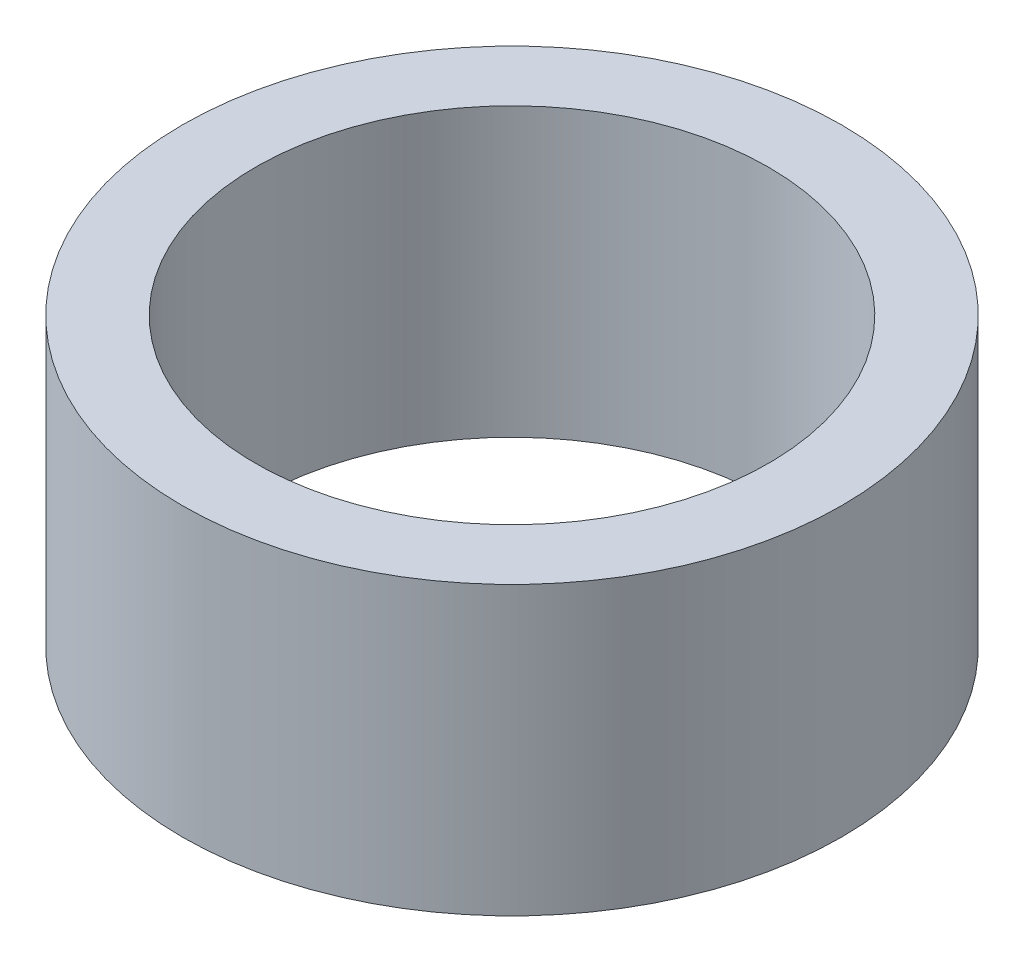
ISO-10303-21;
HEADER;
FILE_DESCRIPTION(('STEP AP214'),'2;1');
FILE_NAME('part.step','',(''),(''),'','','');
FILE_SCHEMA(('AUTOMOTIVE_DESIGN { 1 0 10303 214 1 1 1 1 }'));
ENDSEC;
DATA;
#1=APPLICATION_CONTEXT('core data for automotive mechanical design processes');
#2=APPLICATION_PROTOCOL_DEFINITION('international standard','automotive_design',2000,#1);
#3=PRODUCT_CONTEXT('',#1,'mechanical');
#4=PRODUCT('Part','Part','',(#3));
#5=PRODUCT_RELATED_PRODUCT_CATEGORY('part','',(#4));
#6=PRODUCT_DEFINITION_FORMATION('','',#4);
#7=PRODUCT_DEFINITION_CONTEXT('part definition',#1,'design');
#8=PRODUCT_DEFINITION('design','',#6,#7);
#9=PRODUCT_DEFINITION_SHAPE('','',#8);
#10=(LENGTH_UNIT() NAMED_UNIT(*) SI_UNIT(.MILLI.,.METRE.));
#11=(NAMED_UNIT(*) PLANE_ANGLE_UNIT() SI_UNIT($,.RADIAN.));
#12=(NAMED_UNIT(*) SI_UNIT($,.STERADIAN.) SOLID_ANGLE_UNIT());
#13=UNCERTAINTY_MEASURE_WITH_UNIT(LENGTH_MEASURE(1.E-05),#10,'distance_accuracy_value','');
#14=(GEOMETRIC_REPRESENTATION_CONTEXT(3) GLOBAL_UNCERTAINTY_ASSIGNED_CONTEXT((#13)) GLOBAL_UNIT_ASSIGNED_CONTEXT((#10,
#11,#12)) REPRESENTATION_CONTEXT('',''));
#15=CARTESIAN_POINT('',(0.,0.,0.));
#16=DIRECTION('',(0.,0.,1.));
#17=DIRECTION('',(1.,0.,0.));
#18=AXIS2_PLACEMENT_3D('',#15,#16,#17);
#19=CARTESIAN_POINT('',(0.,4.699499999,0.));
#20=DIRECTION('',(0.,1.,0.));
#21=DIRECTION('',(0.,0.,1.));
#22=AXIS2_PLACEMENT_3D('',#19,#20,#21);
#23=PLANE('',#22);
#24=CARTESIAN_POINT('',(0.,4.699499999,0.));
#25=DIRECTION('',(0.,1.,0.));
#26=DIRECTION('',(0.,0.,1.));
#27=AXIS2_PLACEMENT_3D('',#24,#25,#26);
#28=CIRCLE('',#27,5.3975);
#29=CARTESIAN_POINT('',(0.,4.699499999,-5.3975));
#30=VERTEX_POINT('',#29);
#31=EDGE_CURVE('E10',#30,#30,#28,.T.);
#32=ORIENTED_EDGE('',*,*,#31,.T.);
#33=EDGE_LOOP('',(#32));
#34=FACE_BOUND('',#33,.T.);
#35=CARTESIAN_POINT('',(0.,4.699499999,0.));
#36=DIRECTION('',(0.,1.,0.));
#37=DIRECTION('',(0.,0.,1.));
#38=AXIS2_PLACEMENT_3D('',#35,#36,#37);
#39=CIRCLE('',#38,4.19989);
#40=CARTESIAN_POINT('',(0.,4.699499999,-4.19989));
#41=VERTEX_POINT('',#40);
#42=EDGE_CURVE('E56',#41,#41,#39,.T.);
#43=ORIENTED_EDGE('',*,*,#42,.F.);
#44=EDGE_LOOP('',(#43));
#45=FACE_BOUND('',#44,.T.);
#46=ADVANCED_FACE('F43',(#34,#45),#23,.T.);
#47=CARTESIAN_POINT('',(0.,0.,0.));
#48=DIRECTION('',(0.,1.,0.));
#49=DIRECTION('',(0.,0.,1.));
#50=AXIS2_PLACEMENT_3D('',#47,#48,#49);
#51=PLANE('',#50);
#52=CARTESIAN_POINT('',(0.,0.,0.));
#53=DIRECTION('',(0.,1.,0.));
#54=DIRECTION('',(0.,0.,1.));
#55=AXIS2_PLACEMENT_3D('',#52,#53,#54);
#56=CIRCLE('',#55,5.3975);
#57=CARTESIAN_POINT('',(0.,0.,-5.3975));
#58=VERTEX_POINT('',#57);
#59=EDGE_CURVE('E47',#58,#58,#56,.T.);
#60=ORIENTED_EDGE('',*,*,#59,.F.);
#61=EDGE_LOOP('',(#60));
#62=FACE_BOUND('',#61,.T.);
#63=CARTESIAN_POINT('',(0.,0.,0.));
#64=DIRECTION('',(0.,1.,0.));
#65=DIRECTION('',(0.,0.,1.));
#66=AXIS2_PLACEMENT_3D('',#63,#64,#65);
#67=CIRCLE('',#66,4.19989);
#68=CARTESIAN_POINT('',(0.,0.,-4.19989));
#69=VERTEX_POINT('',#68);
#70=EDGE_CURVE('E58',#69,#69,#67,.T.);
#71=ORIENTED_EDGE('',*,*,#70,.T.);
#72=EDGE_LOOP('',(#71));
#73=FACE_BOUND('',#72,.T.);
#74=ADVANCED_FACE('F70',(#62,#73),#51,.F.);
#75=CARTESIAN_POINT('',(0.,4.699499999,0.));
#76=DIRECTION('',(0.,-1.,0.));
#77=DIRECTION('',(0.,0.,-1.));
#78=AXIS2_PLACEMENT_3D('',#75,#76,#77);
#79=CYLINDRICAL_SURFACE('',#78,5.3975);
#80=CARTESIAN_POINT('',(0.,4.699499999,-5.3975));
#81=CARTESIAN_POINT('',(0.,4.65054687401042,-5.3975));
#82=CARTESIAN_POINT('',(0.,4.60159374902083,-5.3975));
#83=CARTESIAN_POINT('',(0.,4.50368749904167,-5.3975));
#84=CARTESIAN_POINT('',(0.,4.45473437405208,-5.3975));
#85=CARTESIAN_POINT('',(0.,4.35682812407292,-5.3975));
#86=CARTESIAN_POINT('',(0.,4.30787499908333,-5.3975));
#87=CARTESIAN_POINT('',(0.,4.20996874910417,-5.3975));
#88=CARTESIAN_POINT('',(0.,4.16101562411458,-5.3975));
#89=CARTESIAN_POINT('',(0.,4.06310937413542,-5.3975));
#90=CARTESIAN_POINT('',(0.,4.01415624914583,-5.3975));
#91=CARTESIAN_POINT('',(0.,3.91624999916667,-5.3975));
#92=CARTESIAN_POINT('',(0.,3.86729687417708,-5.3975));
#93=CARTESIAN_POINT('',(0.,3.76939062419792,-5.3975));
#94=CARTESIAN_POINT('',(0.,3.72043749920833,-5.3975));
#95=CARTESIAN_POINT('',(0.,3.62253124922917,-5.3975));
#96=CARTESIAN_POINT('',(0.,3.57357812423958,-5.3975));
#97=CARTESIAN_POINT('',(0.,3.47567187426042,-5.3975));
#98=CARTESIAN_POINT('',(0.,3.42671874927083,-5.3975));
#99=CARTESIAN_POINT('',(0.,3.32881249929167,-5.3975));
#100=CARTESIAN_POINT('',(0.,3.27985937430208,-5.3975));
#101=CARTESIAN_POINT('',(0.,3.18195312432292,-5.3975));
#102=CARTESIAN_POINT('',(0.,3.13299999933333,-5.3975));
#103=CARTESIAN_POINT('',(0.,3.03509374935417,-5.3975));
#104=CARTESIAN_POINT('',(0.,2.98614062436458,-5.3975));
#105=CARTESIAN_POINT('',(0.,2.88823437438542,-5.3975));
#106=CARTESIAN_POINT('',(0.,2.83928124939583,-5.3975));
#107=CARTESIAN_POINT('',(0.,2.74137499941667,-5.3975));
#108=CARTESIAN_POINT('',(0.,2.69242187442708,-5.3975));
#109=CARTESIAN_POINT('',(0.,2.59451562444792,-5.3975));
#110=CARTESIAN_POINT('',(0.,2.54556249945833,-5.3975));
#111=CARTESIAN_POINT('',(0.,2.44765624947917,-5.3975));
#112=CARTESIAN_POINT('',(0.,2.39870312448958,-5.3975));
#113=CARTESIAN_POINT('',(0.,2.30079687451042,-5.3975));
#114=CARTESIAN_POINT('',(0.,2.25184374952083,-5.3975));
#115=CARTESIAN_POINT('',(0.,2.15393749954167,-5.3975));
#116=CARTESIAN_POINT('',(0.,2.10498437455208,-5.3975));
#117=CARTESIAN_POINT('',(0.,2.00707812457292,-5.3975));
#118=CARTESIAN_POINT('',(0.,1.95812499958333,-5.3975));
#119=CARTESIAN_POINT('',(0.,1.86021874960417,-5.3975));
#120=CARTESIAN_POINT('',(0.,1.81126562461458,-5.3975));
#121=CARTESIAN_POINT('',(0.,1.71335937463542,-5.3975));
#122=CARTESIAN_POINT('',(0.,1.66440624964583,-5.3975));
#123=CARTESIAN_POINT('',(0.,1.56649999966667,-5.3975));
#124=CARTESIAN_POINT('',(0.,1.51754687467708,-5.3975));
#125=CARTESIAN_POINT('',(0.,1.41964062469792,-5.3975));
#126=CARTESIAN_POINT('',(0.,1.37068749970833,-5.3975));
#127=CARTESIAN_POINT('',(0.,1.27278124972917,-5.3975));
#128=CARTESIAN_POINT('',(0.,1.22382812473958,-5.3975));
#129=CARTESIAN_POINT('',(0.,1.12592187476042,-5.3975));
#130=CARTESIAN_POINT('',(0.,1.07696874977083,-5.3975));
#131=CARTESIAN_POINT('',(0.,0.979062499791667,-5.3975));
#132=CARTESIAN_POINT('',(0.,0.930109374802083,-5.3975));
#133=CARTESIAN_POINT('',(0.,0.832203124822917,-5.3975));
#134=CARTESIAN_POINT('',(0.,0.783249999833333,-5.3975));
#135=CARTESIAN_POINT('',(0.,0.685343749854167,-5.3975));
#136=CARTESIAN_POINT('',(0.,0.636390624864583,-5.3975));
#137=CARTESIAN_POINT('',(0.,0.538484374885416,-5.3975));
#138=CARTESIAN_POINT('',(0.,0.489531249895833,-5.3975));
#139=CARTESIAN_POINT('',(0.,0.391624999916667,-5.3975));
#140=CARTESIAN_POINT('',(0.,0.342671874927084,-5.3975));
#141=CARTESIAN_POINT('',(0.,0.244765624947917,-5.3975));
#142=CARTESIAN_POINT('',(0.,0.195812499958333,-5.3975));
#143=CARTESIAN_POINT('',(0.,0.0979062499791664,-5.3975));
#144=CARTESIAN_POINT('',(0.,0.0489531249895832,-5.3975));
#145=CARTESIAN_POINT('',(0.,0.,-5.3975));
#146=B_SPLINE_CURVE_WITH_KNOTS('',3,(#80,#81,#82,#83,#84,#85,#86,#87,#88,#89,#90,#91,#92,#93,
#94,#95,#96,#97,#98,#99,#100,#101,#102,#103,#104,#105,#106,#107,#108,#109,#110,#111,#112,#113,
#114,#115,#116,#117,#118,#119,#120,#121,#122,#123,#124,#125,#126,#127,#128,#129,#130,#131,#132,
#133,#134,#135,#136,#137,#138,#139,#140,#141,#142,#143,#144,#145),.UNSPECIFIED.,.F.,.F.,(4,2,2,
2,2,2,2,2,2,2,2,2,2,2,2,2,2,2,2,2,2,2,2,2,2,2,2,2,2,2,2,2,4),(0.,0.14685937496875,
0.293718749937499,0.440578124906249,0.587437499875,0.734296874843749,0.881156249812499,
1.02801562478125,1.17487499975,1.32173437471875,1.4685937496875,1.61545312465625,1.762312499625,
1.90917187459375,2.0560312495625,2.20289062453125,2.3497499995,2.49660937446875,2.6434687494375,
2.79032812440625,2.937187499375,3.08404687434375,3.2309062493125,3.37776562428125,3.52462499925,
3.67148437421875,3.8183437491875,3.96520312415625,4.112062499125,4.25892187409375,
4.4057812490625,4.55264062403125,4.699499999),.UNSPECIFIED.);
#147=EDGE_CURVE('BSEAM45',#30,#58,#146,.T.);
#148=ORIENTED_EDGE('',*,*,#31,.F.);
#149=ORIENTED_EDGE('',*,*,#59,.T.);
#150=ORIENTED_EDGE('',*,*,#147,.T.);
#151=ORIENTED_EDGE('',*,*,#147,.F.);
#152=EDGE_LOOP('',(#148,#150,#149,#151));
#153=FACE_BOUND('',#152,.T.);
#154=ADVANCED_FACE('F45',(#153),#79,.T.);
#155=CARTESIAN_POINT('',(0.,4.699499999,0.));
#156=DIRECTION('',(0.,-1.,0.));
#157=DIRECTION('',(0.,0.,-1.));
#158=AXIS2_PLACEMENT_3D('',#155,#156,#157);
#159=CYLINDRICAL_SURFACE('',#158,4.19989);
#160=CARTESIAN_POINT('',(0.,4.699499999,-4.19989));
#161=CARTESIAN_POINT('',(0.,4.65054687401042,-4.19989));
#162=CARTESIAN_POINT('',(0.,4.60159374902083,-4.19989));
#163=CARTESIAN_POINT('',(0.,4.50368749904167,-4.19989));
#164=CARTESIAN_POINT('',(0.,4.45473437405208,-4.19989));
#165=CARTESIAN_POINT('',(0.,4.35682812407292,-4.19989));
#166=CARTESIAN_POINT('',(0.,4.30787499908333,-4.19989));
#167=CARTESIAN_POINT('',(0.,4.20996874910417,-4.19989));
#168=CARTESIAN_POINT('',(0.,4.16101562411458,-4.19989));
#169=CARTESIAN_POINT('',(0.,4.06310937413542,-4.19989));
#170=CARTESIAN_POINT('',(0.,4.01415624914583,-4.19989));
#171=CARTESIAN_POINT('',(0.,3.91624999916667,-4.19989));
#172=CARTESIAN_POINT('',(0.,3.86729687417708,-4.19989));
#173=CARTESIAN_POINT('',(0.,3.76939062419792,-4.19989));
#174=CARTESIAN_POINT('',(0.,3.72043749920833,-4.19989));
#175=CARTESIAN_POINT('',(0.,3.62253124922917,-4.19989));
#176=CARTESIAN_POINT('',(0.,3.57357812423958,-4.19989));
#177=CARTESIAN_POINT('',(0.,3.47567187426042,-4.19989));
#178=CARTESIAN_POINT('',(0.,3.42671874927083,-4.19989));
#179=CARTESIAN_POINT('',(0.,3.32881249929167,-4.19989));
#180=CARTESIAN_POINT('',(0.,3.27985937430208,-4.19989));
#181=CARTESIAN_POINT('',(0.,3.18195312432292,-4.19989));
#182=CARTESIAN_POINT('',(0.,3.13299999933333,-4.19989));
#183=CARTESIAN_POINT('',(0.,3.03509374935417,-4.19989));
#184=CARTESIAN_POINT('',(0.,2.98614062436458,-4.19989));
#185=CARTESIAN_POINT('',(0.,2.88823437438542,-4.19989));
#186=CARTESIAN_POINT('',(0.,2.83928124939583,-4.19989));
#187=CARTESIAN_POINT('',(0.,2.74137499941667,-4.19989));
#188=CARTESIAN_POINT('',(0.,2.69242187442708,-4.19989));
#189=CARTESIAN_POINT('',(0.,2.59451562444792,-4.19989));
#190=CARTESIAN_POINT('',(0.,2.54556249945833,-4.19989));
#191=CARTESIAN_POINT('',(0.,2.44765624947917,-4.19989));
#192=CARTESIAN_POINT('',(0.,2.39870312448958,-4.19989));
#193=CARTESIAN_POINT('',(0.,2.30079687451042,-4.19989));
#194=CARTESIAN_POINT('',(0.,2.25184374952083,-4.19989));
#195=CARTESIAN_POINT('',(0.,2.15393749954167,-4.19989));
#196=CARTESIAN_POINT('',(0.,2.10498437455208,-4.19989));
#197=CARTESIAN_POINT('',(0.,2.00707812457292,-4.19989));
#198=CARTESIAN_POINT('',(0.,1.95812499958333,-4.19989));
#199=CARTESIAN_POINT('',(0.,1.86021874960417,-4.19989));
#200=CARTESIAN_POINT('',(0.,1.81126562461458,-4.19989));
#201=CARTESIAN_POINT('',(0.,1.71335937463542,-4.19989));
#202=CARTESIAN_POINT('',(0.,1.66440624964583,-4.19989));
#203=CARTESIAN_POINT('',(0.,1.56649999966667,-4.19989));
#204=CARTESIAN_POINT('',(0.,1.51754687467708,-4.19989));
#205=CARTESIAN_POINT('',(0.,1.41964062469792,-4.19989));
#206=CARTESIAN_POINT('',(0.,1.37068749970833,-4.19989));
#207=CARTESIAN_POINT('',(0.,1.27278124972917,-4.19989));
#208=CARTESIAN_POINT('',(0.,1.22382812473958,-4.19989));
#209=CARTESIAN_POINT('',(0.,1.12592187476042,-4.19989));
#210=CARTESIAN_POINT('',(0.,1.07696874977083,-4.19989));
#211=CARTESIAN_POINT('',(0.,0.979062499791667,-4.19989));
#212=CARTESIAN_POINT('',(0.,0.930109374802083,-4.19989));
#213=CARTESIAN_POINT('',(0.,0.832203124822917,-4.19989));
#214=CARTESIAN_POINT('',(0.,0.783249999833333,-4.19989));
#215=CARTESIAN_POINT('',(0.,0.685343749854167,-4.19989));
#216=CARTESIAN_POINT('',(0.,0.636390624864583,-4.19989));
#217=CARTESIAN_POINT('',(0.,0.538484374885416,-4.19989));
#218=CARTESIAN_POINT('',(0.,0.489531249895833,-4.19989));
#219=CARTESIAN_POINT('',(0.,0.391624999916667,-4.19989));
#220=CARTESIAN_POINT('',(0.,0.342671874927084,-4.19989));
#221=CARTESIAN_POINT('',(0.,0.244765624947917,-4.19989));
#222=CARTESIAN_POINT('',(0.,0.195812499958333,-4.19989));
#223=CARTESIAN_POINT('',(0.,0.0979062499791664,-4.19989));
#224=CARTESIAN_POINT('',(0.,0.0489531249895832,-4.19989));
#225=CARTESIAN_POINT('',(0.,0.,-4.19989));
#226=B_SPLINE_CURVE_WITH_KNOTS('',3,(#160,#161,#162,#163,#164,#165,#166,#167,#168,#169,#170,
#171,#172,#173,#174,#175,#176,#177,#178,#179,#180,#181,#182,#183,#184,#185,#186,#187,#188,#189,
#190,#191,#192,#193,#194,#195,#196,#197,#198,#199,#200,#201,#202,#203,#204,#205,#206,#207,#208,
#209,#210,#211,#212,#213,#214,#215,#216,#217,#218,#219,#220,#221,#222,#223,#224,#225),
.UNSPECIFIED.,.F.,.F.,(4,2,2,2,2,2,2,2,2,2,2,2,2,2,2,2,2,2,2,2,2,2,2,2,2,2,2,2,2,2,2,2,4),(0.,
0.14685937496875,0.293718749937499,0.440578124906249,0.587437499875,0.734296874843749,
0.881156249812499,1.02801562478125,1.17487499975,1.32173437471875,1.4685937496875,
1.61545312465625,1.762312499625,1.90917187459375,2.0560312495625,2.20289062453125,2.3497499995,
2.49660937446875,2.6434687494375,2.79032812440625,2.937187499375,3.08404687434375,
3.2309062493125,3.37776562428125,3.52462499925,3.67148437421875,3.8183437491875,
3.96520312415625,4.112062499125,4.25892187409375,4.4057812490625,4.55264062403125,4.699499999),.UNSPECIFIED.);
#227=EDGE_CURVE('BSEAM66',#41,#69,#226,.T.);
#228=ORIENTED_EDGE('',*,*,#42,.T.);
#229=ORIENTED_EDGE('',*,*,#70,.F.);
#230=ORIENTED_EDGE('',*,*,#227,.T.);
#231=ORIENTED_EDGE('',*,*,#227,.F.);
#232=EDGE_LOOP('',(#228,#230,#229,#231));
#233=FACE_BOUND('',#232,.T.);
#234=ADVANCED_FACE('F66',(#233),#159,.F.);
#235=CLOSED_SHELL('',(#46,#74,#154,#234));
#236=MANIFOLD_SOLID_BREP('B2',#235);
#237=ADVANCED_BREP_SHAPE_REPRESENTATION('',(#18,#236),#14);
#238=SHAPE_DEFINITION_REPRESENTATION(#9,#237);
ENDSEC;
END-ISO-10303-21;
